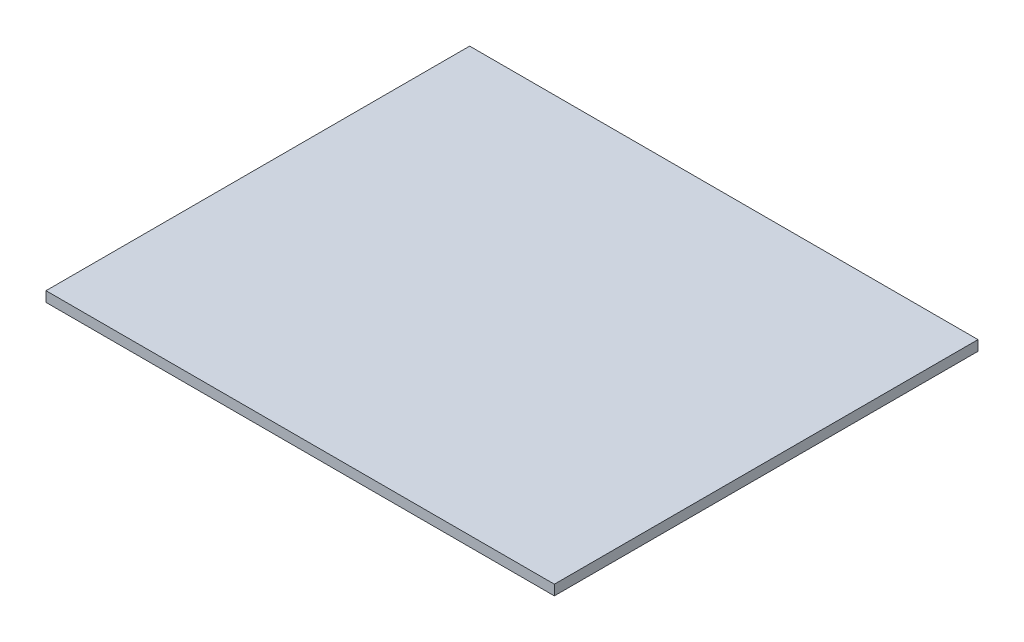
ISO-10303-21;
HEADER;
FILE_DESCRIPTION(('STEP AP214'),'2;1');
FILE_NAME('part.step','',(''),(''),'','','');
FILE_SCHEMA(('AUTOMOTIVE_DESIGN { 1 0 10303 214 1 1 1 1 }'));
ENDSEC;
DATA;
#1=APPLICATION_CONTEXT('core data for automotive mechanical design processes');
#2=APPLICATION_PROTOCOL_DEFINITION('international standard','automotive_design',2000,#1);
#3=PRODUCT_CONTEXT('',#1,'mechanical');
#4=PRODUCT('Part','Part','',(#3));
#5=PRODUCT_RELATED_PRODUCT_CATEGORY('part','',(#4));
#6=PRODUCT_DEFINITION_FORMATION('','',#4);
#7=PRODUCT_DEFINITION_CONTEXT('part definition',#1,'design');
#8=PRODUCT_DEFINITION('design','',#6,#7);
#9=PRODUCT_DEFINITION_SHAPE('','',#8);
#10=(LENGTH_UNIT() NAMED_UNIT(*) SI_UNIT(.MILLI.,.METRE.));
#11=(NAMED_UNIT(*) PLANE_ANGLE_UNIT() SI_UNIT($,.RADIAN.));
#12=(NAMED_UNIT(*) SI_UNIT($,.STERADIAN.) SOLID_ANGLE_UNIT());
#13=UNCERTAINTY_MEASURE_WITH_UNIT(LENGTH_MEASURE(1.E-05),#10,'distance_accuracy_value','');
#14=(GEOMETRIC_REPRESENTATION_CONTEXT(3) GLOBAL_UNCERTAINTY_ASSIGNED_CONTEXT((#13)) GLOBAL_UNIT_ASSIGNED_CONTEXT((#10,
#11,#12)) REPRESENTATION_CONTEXT('',''));
#15=CARTESIAN_POINT('',(0.,0.,0.));
#16=DIRECTION('',(0.,0.,1.));
#17=DIRECTION('',(1.,0.,0.));
#18=AXIS2_PLACEMENT_3D('',#15,#16,#17);
#19=CARTESIAN_POINT('',(-160.054719562243,18.,-275.78659370725));
#20=DIRECTION('',(1.,0.,0.));
#21=DIRECTION('',(0.,0.,-1.));
#22=AXIS2_PLACEMENT_3D('',#19,#20,#21);
#23=PLANE('',#22);
#24=DIRECTION('',(0.,0.,1.));
#25=VECTOR('',#24,1.);
#26=CARTESIAN_POINT('',(-160.054719562243,0.,-275.78659370725));
#27=LINE('',#26,#25);
#28=CARTESIAN_POINT('',(-160.054719562243,0.,-275.78659370725));
#29=VERTEX_POINT('',#28);
#30=CARTESIAN_POINT('',(-160.054719562243,0.,474.21340629275));
#31=VERTEX_POINT('',#30);
#32=EDGE_CURVE('E98',#29,#31,#27,.T.);
#33=ORIENTED_EDGE('',*,*,#32,.T.);
#34=DIRECTION('',(0.,-1.,0.));
#35=VECTOR('',#34,1.);
#36=CARTESIAN_POINT('',(-160.054719562243,18.,474.21340629275));
#37=LINE('',#36,#35);
#38=CARTESIAN_POINT('',(-160.054719562243,18.,474.21340629275));
#39=VERTEX_POINT('',#38);
#40=EDGE_CURVE('E11',#39,#31,#37,.T.);
#41=ORIENTED_EDGE('',*,*,#40,.F.);
#42=DIRECTION('',(0.,0.,1.));
#43=VECTOR('',#42,1.);
#44=CARTESIAN_POINT('',(-160.054719562243,18.,-275.78659370725));
#45=LINE('',#44,#43);
#46=CARTESIAN_POINT('',(-160.054719562243,18.,-275.78659370725));
#47=VERTEX_POINT('',#46);
#48=EDGE_CURVE('E86',#47,#39,#45,.T.);
#49=ORIENTED_EDGE('',*,*,#48,.F.);
#50=DIRECTION('',(0.,-1.,0.));
#51=VECTOR('',#50,1.);
#52=CARTESIAN_POINT('',(-160.054719562243,18.,-275.78659370725));
#53=LINE('',#52,#51);
#54=EDGE_CURVE('E94',#47,#29,#53,.T.);
#55=ORIENTED_EDGE('',*,*,#54,.T.);
#56=EDGE_LOOP('',(#33,#41,#49,#55));
#57=FACE_BOUND('',#56,.T.);
#58=ADVANCED_FACE('F35',(#57),#23,.F.);
#59=CARTESIAN_POINT('',(-160.054719562243,18.,474.21340629275));
#60=DIRECTION('',(0.,0.,-1.));
#61=DIRECTION('',(-1.,0.,0.));
#62=AXIS2_PLACEMENT_3D('',#59,#60,#61);
#63=PLANE('',#62);
#64=DIRECTION('',(1.,0.,0.));
#65=VECTOR('',#64,1.);
#66=CARTESIAN_POINT('',(-160.054719562243,0.,474.21340629275));
#67=LINE('',#66,#65);
#68=CARTESIAN_POINT('',(739.945280437757,0.,474.21340629275));
#69=VERTEX_POINT('',#68);
#70=EDGE_CURVE('E90',#31,#69,#67,.T.);
#71=ORIENTED_EDGE('',*,*,#70,.T.);
#72=DIRECTION('',(0.,-1.,0.));
#73=VECTOR('',#72,1.);
#74=CARTESIAN_POINT('',(739.945280437757,18.,474.21340629275));
#75=LINE('',#74,#73);
#76=CARTESIAN_POINT('',(739.945280437757,18.,474.21340629275));
#77=VERTEX_POINT('',#76);
#78=EDGE_CURVE('E43',#77,#69,#75,.T.);
#79=ORIENTED_EDGE('',*,*,#78,.F.);
#80=DIRECTION('',(1.,0.,0.));
#81=VECTOR('',#80,1.);
#82=CARTESIAN_POINT('',(-160.054719562243,18.,474.21340629275));
#83=LINE('',#82,#81);
#84=EDGE_CURVE('E81',#39,#77,#83,.T.);
#85=ORIENTED_EDGE('',*,*,#84,.F.);
#86=ORIENTED_EDGE('',*,*,#40,.T.);
#87=EDGE_LOOP('',(#71,#79,#85,#86));
#88=FACE_BOUND('',#87,.T.);
#89=ADVANCED_FACE('F89',(#88),#63,.F.);
#90=CARTESIAN_POINT('',(739.945280437757,18.,-275.78659370725));
#91=DIRECTION('',(-1.,0.,0.));
#92=DIRECTION('',(0.,0.,1.));
#93=AXIS2_PLACEMENT_3D('',#90,#91,#92);
#94=PLANE('',#93);
#95=DIRECTION('',(0.,0.,-1.));
#96=VECTOR('',#95,1.);
#97=CARTESIAN_POINT('',(739.945280437757,0.,-275.78659370725));
#98=LINE('',#97,#96);
#99=CARTESIAN_POINT('',(739.945280437757,0.,-275.78659370725));
#100=VERTEX_POINT('',#99);
#101=EDGE_CURVE('E68',#69,#100,#98,.T.);
#102=ORIENTED_EDGE('',*,*,#101,.T.);
#103=DIRECTION('',(0.,-1.,0.));
#104=VECTOR('',#103,1.);
#105=CARTESIAN_POINT('',(739.945280437757,18.,-275.78659370725));
#106=LINE('',#105,#104);
#107=CARTESIAN_POINT('',(739.945280437757,18.,-275.78659370725));
#108=VERTEX_POINT('',#107);
#109=EDGE_CURVE('E91',#108,#100,#106,.T.);
#110=ORIENTED_EDGE('',*,*,#109,.F.);
#111=DIRECTION('',(0.,0.,-1.));
#112=VECTOR('',#111,1.);
#113=CARTESIAN_POINT('',(739.945280437757,18.,-275.78659370725));
#114=LINE('',#113,#112);
#115=EDGE_CURVE('E84',#77,#108,#114,.T.);
#116=ORIENTED_EDGE('',*,*,#115,.F.);
#117=ORIENTED_EDGE('',*,*,#78,.T.);
#118=EDGE_LOOP('',(#102,#110,#116,#117));
#119=FACE_BOUND('',#118,.T.);
#120=ADVANCED_FACE('F92',(#119),#94,.F.);
#121=CARTESIAN_POINT('',(-160.054719562243,18.,-275.78659370725));
#122=DIRECTION('',(0.,0.,1.));
#123=DIRECTION('',(1.,0.,0.));
#124=AXIS2_PLACEMENT_3D('',#121,#122,#123);
#125=PLANE('',#124);
#126=DIRECTION('',(-1.,0.,0.));
#127=VECTOR('',#126,1.);
#128=CARTESIAN_POINT('',(-160.054719562243,0.,-275.78659370725));
#129=LINE('',#128,#127);
#130=EDGE_CURVE('E74',#100,#29,#129,.T.);
#131=ORIENTED_EDGE('',*,*,#130,.T.);
#132=ORIENTED_EDGE('',*,*,#54,.F.);
#133=DIRECTION('',(-1.,0.,0.));
#134=VECTOR('',#133,1.);
#135=CARTESIAN_POINT('',(-160.054719562243,18.,-275.78659370725));
#136=LINE('',#135,#134);
#137=EDGE_CURVE('E51',#108,#47,#136,.T.);
#138=ORIENTED_EDGE('',*,*,#137,.F.);
#139=ORIENTED_EDGE('',*,*,#109,.T.);
#140=EDGE_LOOP('',(#131,#132,#138,#139));
#141=FACE_BOUND('',#140,.T.);
#142=ADVANCED_FACE('F105',(#141),#125,.F.);
#143=CARTESIAN_POINT('',(0.,18.,0.));
#144=DIRECTION('',(0.,1.,0.));
#145=DIRECTION('',(0.,0.,1.));
#146=AXIS2_PLACEMENT_3D('',#143,#144,#145);
#147=PLANE('',#146);
#148=ORIENTED_EDGE('',*,*,#48,.T.);
#149=ORIENTED_EDGE('',*,*,#84,.T.);
#150=ORIENTED_EDGE('',*,*,#115,.T.);
#151=ORIENTED_EDGE('',*,*,#137,.T.);
#152=EDGE_LOOP('',(#148,#149,#150,#151));
#153=FACE_BOUND('',#152,.T.);
#154=ADVANCED_FACE('F82',(#153),#147,.T.);
#155=CARTESIAN_POINT('',(0.,0.,0.));
#156=DIRECTION('',(0.,1.,0.));
#157=DIRECTION('',(0.,0.,1.));
#158=AXIS2_PLACEMENT_3D('',#155,#156,#157);
#159=PLANE('',#158);
#160=ORIENTED_EDGE('',*,*,#32,.F.);
#161=ORIENTED_EDGE('',*,*,#130,.F.);
#162=ORIENTED_EDGE('',*,*,#101,.F.);
#163=ORIENTED_EDGE('',*,*,#70,.F.);
#164=EDGE_LOOP('',(#160,#161,#162,#163));
#165=FACE_BOUND('',#164,.T.);
#166=ADVANCED_FACE('F108',(#165),#159,.F.);
#167=CLOSED_SHELL('',(#58,#89,#120,#142,#154,#166));
#168=MANIFOLD_SOLID_BREP('B2',#167);
#169=ADVANCED_BREP_SHAPE_REPRESENTATION('',(#18,#168),#14);
#170=SHAPE_DEFINITION_REPRESENTATION(#9,#169);
ENDSEC;
END-ISO-10303-21;
